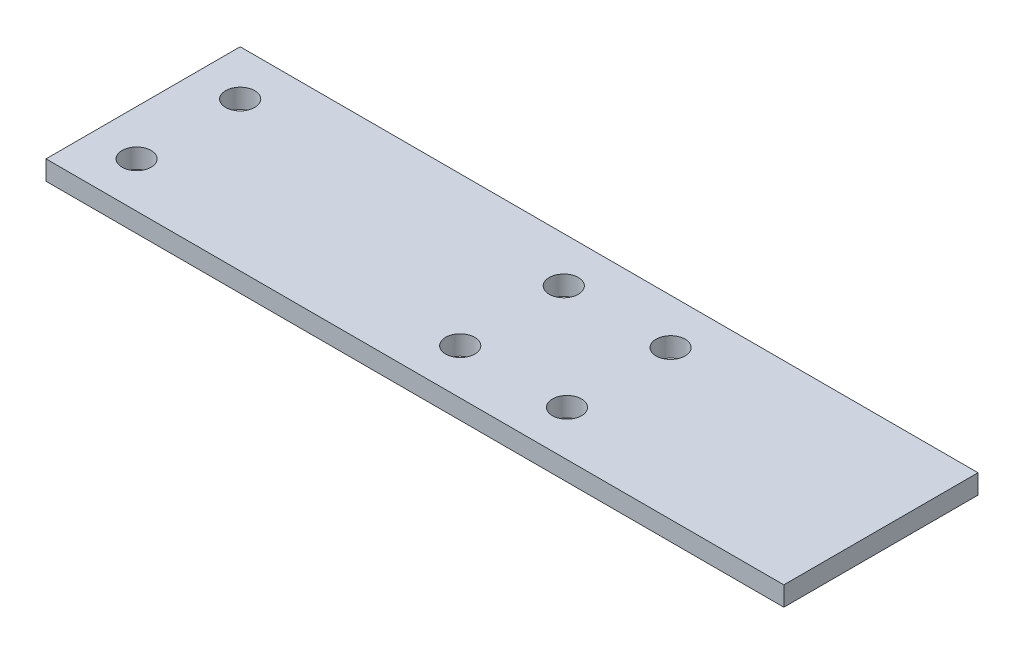
ISO-10303-21;
HEADER;
FILE_DESCRIPTION(('STEP AP214'),'2;1');
FILE_NAME('part.step','',(''),(''),'','','');
FILE_SCHEMA(('AUTOMOTIVE_DESIGN { 1 0 10303 214 1 1 1 1 }'));
ENDSEC;
DATA;
#1=APPLICATION_CONTEXT('core data for automotive mechanical design processes');
#2=APPLICATION_PROTOCOL_DEFINITION('international standard','automotive_design',2000,#1);
#3=PRODUCT_CONTEXT('',#1,'mechanical');
#4=PRODUCT('Part','Part','',(#3));
#5=PRODUCT_RELATED_PRODUCT_CATEGORY('part','',(#4));
#6=PRODUCT_DEFINITION_FORMATION('','',#4);
#7=PRODUCT_DEFINITION_CONTEXT('part definition',#1,'design');
#8=PRODUCT_DEFINITION('design','',#6,#7);
#9=PRODUCT_DEFINITION_SHAPE('','',#8);
#10=(LENGTH_UNIT() NAMED_UNIT(*) SI_UNIT(.MILLI.,.METRE.));
#11=(NAMED_UNIT(*) PLANE_ANGLE_UNIT() SI_UNIT($,.RADIAN.));
#12=(NAMED_UNIT(*) SI_UNIT($,.STERADIAN.) SOLID_ANGLE_UNIT());
#13=UNCERTAINTY_MEASURE_WITH_UNIT(LENGTH_MEASURE(1.E-05),#10,'distance_accuracy_value','');
#14=(GEOMETRIC_REPRESENTATION_CONTEXT(3) GLOBAL_UNCERTAINTY_ASSIGNED_CONTEXT((#13)) GLOBAL_UNIT_ASSIGNED_CONTEXT((#10,
#11,#12)) REPRESENTATION_CONTEXT('',''));
#15=CARTESIAN_POINT('',(0.,0.,0.));
#16=DIRECTION('',(0.,0.,1.));
#17=DIRECTION('',(1.,0.,0.));
#18=AXIS2_PLACEMENT_3D('',#15,#16,#17);
#19=CARTESIAN_POINT('',(0.,3.,0.));
#20=DIRECTION('',(0.,-1.,0.));
#21=DIRECTION('',(0.,0.,-1.));
#22=AXIS2_PLACEMENT_3D('',#19,#20,#21);
#23=PLANE('',#22);
#24=DIRECTION('',(-1.,0.,0.));
#25=VECTOR('',#24,1.);
#26=CARTESIAN_POINT('',(-7.,3.,-23.));
#27=LINE('',#26,#25);
#28=CARTESIAN_POINT('',(107.,3.,-23.));
#29=VERTEX_POINT('',#28);
#30=CARTESIAN_POINT('',(-7.,3.,-23.));
#31=VERTEX_POINT('',#30);
#32=EDGE_CURVE('E50',#29,#31,#27,.T.);
#33=ORIENTED_EDGE('',*,*,#32,.T.);
#34=DIRECTION('',(0.,0.,1.));
#35=VECTOR('',#34,1.);
#36=CARTESIAN_POINT('',(-7.,3.,-23.));
#37=LINE('',#36,#35);
#38=CARTESIAN_POINT('',(-7.,3.,7.));
#39=VERTEX_POINT('',#38);
#40=EDGE_CURVE('E80',#31,#39,#37,.T.);
#41=ORIENTED_EDGE('',*,*,#40,.T.);
#42=DIRECTION('',(1.,0.,0.));
#43=VECTOR('',#42,1.);
#44=CARTESIAN_POINT('',(57.,3.,7.));
#45=LINE('',#44,#43);
#46=CARTESIAN_POINT('',(107.,3.,7.));
#47=VERTEX_POINT('',#46);
#48=EDGE_CURVE('E84',#39,#47,#45,.T.);
#49=ORIENTED_EDGE('',*,*,#48,.T.);
#50=DIRECTION('',(0.,0.,-1.));
#51=VECTOR('',#50,1.);
#52=CARTESIAN_POINT('',(107.,3.,-23.));
#53=LINE('',#52,#51);
#54=EDGE_CURVE('E92',#47,#29,#53,.T.);
#55=ORIENTED_EDGE('',*,*,#54,.T.);
#56=EDGE_LOOP('',(#33,#41,#49,#55));
#57=FACE_BOUND('',#56,.T.);
#58=CARTESIAN_POINT('',(0.,3.,0.));
#59=DIRECTION('',(0.,1.,0.));
#60=DIRECTION('',(0.,0.,1.));
#61=AXIS2_PLACEMENT_3D('',#58,#59,#60);
#62=CIRCLE('',#61,2.25);
#63=CARTESIAN_POINT('',(0.,3.,2.25));
#64=VERTEX_POINT('',#63);
#65=EDGE_CURVE('E99',#64,#64,#62,.T.);
#66=ORIENTED_EDGE('',*,*,#65,.F.);
#67=EDGE_LOOP('',(#66));
#68=FACE_BOUND('',#67,.T.);
#69=CARTESIAN_POINT('',(0.,3.,-16.));
#70=DIRECTION('',(0.,1.,0.));
#71=DIRECTION('',(0.,0.,1.));
#72=AXIS2_PLACEMENT_3D('',#69,#70,#71);
#73=CIRCLE('',#72,2.25);
#74=CARTESIAN_POINT('',(0.,3.,-13.75));
#75=VERTEX_POINT('',#74);
#76=EDGE_CURVE('E180',#75,#75,#73,.T.);
#77=ORIENTED_EDGE('',*,*,#76,.F.);
#78=EDGE_LOOP('',(#77));
#79=FACE_BOUND('',#78,.T.);
#80=CARTESIAN_POINT('',(50.,3.,0.));
#81=DIRECTION('',(0.,1.,0.));
#82=DIRECTION('',(0.,0.,1.));
#83=AXIS2_PLACEMENT_3D('',#80,#81,#82);
#84=CIRCLE('',#83,2.25);
#85=CARTESIAN_POINT('',(50.,3.,2.25));
#86=VERTEX_POINT('',#85);
#87=EDGE_CURVE('E174',#86,#86,#84,.T.);
#88=ORIENTED_EDGE('',*,*,#87,.F.);
#89=EDGE_LOOP('',(#88));
#90=FACE_BOUND('',#89,.T.);
#91=CARTESIAN_POINT('',(50.,3.,-16.));
#92=DIRECTION('',(0.,1.,0.));
#93=DIRECTION('',(0.,0.,1.));
#94=AXIS2_PLACEMENT_3D('',#91,#92,#93);
#95=CIRCLE('',#94,2.25);
#96=CARTESIAN_POINT('',(50.,3.,-13.75));
#97=VERTEX_POINT('',#96);
#98=EDGE_CURVE('E168',#97,#97,#95,.T.);
#99=ORIENTED_EDGE('',*,*,#98,.F.);
#100=EDGE_LOOP('',(#99));
#101=FACE_BOUND('',#100,.T.);
#102=CARTESIAN_POINT('',(66.5,3.,-16.));
#103=DIRECTION('',(0.,1.,0.));
#104=DIRECTION('',(0.,0.,1.));
#105=AXIS2_PLACEMENT_3D('',#102,#103,#104);
#106=CIRCLE('',#105,2.25);
#107=CARTESIAN_POINT('',(66.5,3.,-13.75));
#108=VERTEX_POINT('',#107);
#109=EDGE_CURVE('E162',#108,#108,#106,.T.);
#110=ORIENTED_EDGE('',*,*,#109,.F.);
#111=EDGE_LOOP('',(#110));
#112=FACE_BOUND('',#111,.T.);
#113=CARTESIAN_POINT('',(66.5,3.,0.));
#114=DIRECTION('',(0.,1.,0.));
#115=DIRECTION('',(0.,0.,1.));
#116=AXIS2_PLACEMENT_3D('',#113,#114,#115);
#117=CIRCLE('',#116,2.25);
#118=CARTESIAN_POINT('',(66.5,3.,2.25));
#119=VERTEX_POINT('',#118);
#120=EDGE_CURVE('E153',#119,#119,#117,.T.);
#121=ORIENTED_EDGE('',*,*,#120,.F.);
#122=EDGE_LOOP('',(#121));
#123=FACE_BOUND('',#122,.T.);
#124=ADVANCED_FACE('F33',(#57,#68,#79,#90,#101,#112,#123),#23,.F.);
#125=CARTESIAN_POINT('',(0.,0.,0.));
#126=DIRECTION('',(0.,-1.,0.));
#127=DIRECTION('',(0.,0.,-1.));
#128=AXIS2_PLACEMENT_3D('',#125,#126,#127);
#129=PLANE('',#128);
#130=CARTESIAN_POINT('',(66.5,0.,-16.));
#131=DIRECTION('',(0.,1.,0.));
#132=DIRECTION('',(0.,0.,1.));
#133=AXIS2_PLACEMENT_3D('',#130,#131,#132);
#134=CIRCLE('',#133,2.25);
#135=CARTESIAN_POINT('',(66.5,0.,-13.75));
#136=VERTEX_POINT('',#135);
#137=EDGE_CURVE('E159',#136,#136,#134,.T.);
#138=ORIENTED_EDGE('',*,*,#137,.T.);
#139=EDGE_LOOP('',(#138));
#140=FACE_BOUND('',#139,.T.);
#141=CARTESIAN_POINT('',(50.,0.,0.));
#142=DIRECTION('',(0.,1.,0.));
#143=DIRECTION('',(0.,0.,1.));
#144=AXIS2_PLACEMENT_3D('',#141,#142,#143);
#145=CIRCLE('',#144,2.25);
#146=CARTESIAN_POINT('',(50.,0.,2.25));
#147=VERTEX_POINT('',#146);
#148=EDGE_CURVE('E171',#147,#147,#145,.T.);
#149=ORIENTED_EDGE('',*,*,#148,.T.);
#150=EDGE_LOOP('',(#149));
#151=FACE_BOUND('',#150,.T.);
#152=CARTESIAN_POINT('',(0.,0.,0.));
#153=DIRECTION('',(0.,1.,0.));
#154=DIRECTION('',(0.,0.,1.));
#155=AXIS2_PLACEMENT_3D('',#152,#153,#154);
#156=CIRCLE('',#155,2.25);
#157=CARTESIAN_POINT('',(0.,0.,2.25));
#158=VERTEX_POINT('',#157);
#159=EDGE_CURVE('E183',#158,#158,#156,.T.);
#160=ORIENTED_EDGE('',*,*,#159,.T.);
#161=EDGE_LOOP('',(#160));
#162=FACE_BOUND('',#161,.T.);
#163=DIRECTION('',(0.,0.,1.));
#164=VECTOR('',#163,1.);
#165=CARTESIAN_POINT('',(-7.,0.,-23.));
#166=LINE('',#165,#164);
#167=CARTESIAN_POINT('',(-7.,0.,-23.));
#168=VERTEX_POINT('',#167);
#169=CARTESIAN_POINT('',(-7.,0.,7.));
#170=VERTEX_POINT('',#169);
#171=EDGE_CURVE('E88',#168,#170,#166,.T.);
#172=ORIENTED_EDGE('',*,*,#171,.F.);
#173=DIRECTION('',(-1.,0.,0.));
#174=VECTOR('',#173,1.);
#175=CARTESIAN_POINT('',(57.,0.,-23.));
#176=LINE('',#175,#174);
#177=CARTESIAN_POINT('',(107.,0.,-23.));
#178=VERTEX_POINT('',#177);
#179=EDGE_CURVE('E102',#178,#168,#176,.T.);
#180=ORIENTED_EDGE('',*,*,#179,.F.);
#181=DIRECTION('',(0.,0.,-1.));
#182=VECTOR('',#181,1.);
#183=CARTESIAN_POINT('',(107.,0.,-23.));
#184=LINE('',#183,#182);
#185=CARTESIAN_POINT('',(107.,0.,7.));
#186=VERTEX_POINT('',#185);
#187=EDGE_CURVE('E74',#186,#178,#184,.T.);
#188=ORIENTED_EDGE('',*,*,#187,.F.);
#189=DIRECTION('',(1.,0.,0.));
#190=VECTOR('',#189,1.);
#191=CARTESIAN_POINT('',(107.,0.,7.));
#192=LINE('',#191,#190);
#193=EDGE_CURVE('E67',#170,#186,#192,.T.);
#194=ORIENTED_EDGE('',*,*,#193,.F.);
#195=EDGE_LOOP('',(#172,#180,#188,#194));
#196=FACE_BOUND('',#195,.T.);
#197=CARTESIAN_POINT('',(0.,0.,-16.));
#198=DIRECTION('',(0.,1.,0.));
#199=DIRECTION('',(0.,0.,1.));
#200=AXIS2_PLACEMENT_3D('',#197,#198,#199);
#201=CIRCLE('',#200,2.25);
#202=CARTESIAN_POINT('',(0.,0.,-13.75));
#203=VERTEX_POINT('',#202);
#204=EDGE_CURVE('E177',#203,#203,#201,.T.);
#205=ORIENTED_EDGE('',*,*,#204,.T.);
#206=EDGE_LOOP('',(#205));
#207=FACE_BOUND('',#206,.T.);
#208=CARTESIAN_POINT('',(50.,0.,-16.));
#209=DIRECTION('',(0.,1.,0.));
#210=DIRECTION('',(0.,0.,1.));
#211=AXIS2_PLACEMENT_3D('',#208,#209,#210);
#212=CIRCLE('',#211,2.25);
#213=CARTESIAN_POINT('',(50.,0.,-13.75));
#214=VERTEX_POINT('',#213);
#215=EDGE_CURVE('E165',#214,#214,#212,.T.);
#216=ORIENTED_EDGE('',*,*,#215,.T.);
#217=EDGE_LOOP('',(#216));
#218=FACE_BOUND('',#217,.T.);
#219=CARTESIAN_POINT('',(66.5,0.,0.));
#220=DIRECTION('',(0.,1.,0.));
#221=DIRECTION('',(0.,0.,1.));
#222=AXIS2_PLACEMENT_3D('',#219,#220,#221);
#223=CIRCLE('',#222,2.25);
#224=CARTESIAN_POINT('',(66.5,0.,2.25));
#225=VERTEX_POINT('',#224);
#226=EDGE_CURVE('E156',#225,#225,#223,.T.);
#227=ORIENTED_EDGE('',*,*,#226,.T.);
#228=EDGE_LOOP('',(#227));
#229=FACE_BOUND('',#228,.T.);
#230=ADVANCED_FACE('F108',(#140,#151,#162,#196,#207,#218,#229),#129,.T.);
#231=CARTESIAN_POINT('',(-7.,3.,-23.));
#232=DIRECTION('',(1.,0.,0.));
#233=DIRECTION('',(0.,0.,-1.));
#234=AXIS2_PLACEMENT_3D('',#231,#232,#233);
#235=PLANE('',#234);
#236=ORIENTED_EDGE('',*,*,#171,.T.);
#237=DIRECTION('',(0.,-1.,0.));
#238=VECTOR('',#237,1.);
#239=CARTESIAN_POINT('',(-7.,3.,7.));
#240=LINE('',#239,#238);
#241=EDGE_CURVE('E42',#39,#170,#240,.T.);
#242=ORIENTED_EDGE('',*,*,#241,.F.);
#243=ORIENTED_EDGE('',*,*,#40,.F.);
#244=DIRECTION('',(0.,-1.,0.));
#245=VECTOR('',#244,1.);
#246=CARTESIAN_POINT('',(-7.,3.,-23.));
#247=LINE('',#246,#245);
#248=EDGE_CURVE('E11',#31,#168,#247,.T.);
#249=ORIENTED_EDGE('',*,*,#248,.T.);
#250=EDGE_LOOP('',(#236,#242,#243,#249));
#251=FACE_BOUND('',#250,.T.);
#252=ADVANCED_FACE('F35',(#251),#235,.F.);
#253=CARTESIAN_POINT('',(107.,3.,7.));
#254=DIRECTION('',(0.,0.,-1.));
#255=DIRECTION('',(-1.,0.,0.));
#256=AXIS2_PLACEMENT_3D('',#253,#254,#255);
#257=PLANE('',#256);
#258=ORIENTED_EDGE('',*,*,#193,.T.);
#259=DIRECTION('',(0.,-1.,0.));
#260=VECTOR('',#259,1.);
#261=CARTESIAN_POINT('',(107.,3.,7.));
#262=LINE('',#261,#260);
#263=EDGE_CURVE('E89',#47,#186,#262,.T.);
#264=ORIENTED_EDGE('',*,*,#263,.F.);
#265=ORIENTED_EDGE('',*,*,#48,.F.);
#266=ORIENTED_EDGE('',*,*,#241,.T.);
#267=EDGE_LOOP('',(#258,#264,#265,#266));
#268=FACE_BOUND('',#267,.T.);
#269=ADVANCED_FACE('F90',(#268),#257,.F.);
#270=CARTESIAN_POINT('',(107.,3.,-23.));
#271=DIRECTION('',(-1.,0.,0.));
#272=DIRECTION('',(0.,0.,1.));
#273=AXIS2_PLACEMENT_3D('',#270,#271,#272);
#274=PLANE('',#273);
#275=ORIENTED_EDGE('',*,*,#187,.T.);
#276=DIRECTION('',(0.,-1.,0.));
#277=VECTOR('',#276,1.);
#278=CARTESIAN_POINT('',(107.,3.,-23.));
#279=LINE('',#278,#277);
#280=EDGE_CURVE('E94',#29,#178,#279,.T.);
#281=ORIENTED_EDGE('',*,*,#280,.F.);
#282=ORIENTED_EDGE('',*,*,#54,.F.);
#283=ORIENTED_EDGE('',*,*,#263,.T.);
#284=EDGE_LOOP('',(#275,#281,#282,#283));
#285=FACE_BOUND('',#284,.T.);
#286=ADVANCED_FACE('F105',(#285),#274,.F.);
#287=CARTESIAN_POINT('',(57.,3.,-23.));
#288=DIRECTION('',(0.,0.,1.));
#289=DIRECTION('',(1.,0.,0.));
#290=AXIS2_PLACEMENT_3D('',#287,#288,#289);
#291=PLANE('',#290);
#292=ORIENTED_EDGE('',*,*,#179,.T.);
#293=ORIENTED_EDGE('',*,*,#248,.F.);
#294=ORIENTED_EDGE('',*,*,#32,.F.);
#295=ORIENTED_EDGE('',*,*,#280,.T.);
#296=EDGE_LOOP('',(#292,#293,#294,#295));
#297=FACE_BOUND('',#296,.T.);
#298=ADVANCED_FACE('F110',(#297),#291,.F.);
#299=CARTESIAN_POINT('',(0.,3.,0.));
#300=DIRECTION('',(0.,-1.,0.));
#301=DIRECTION('',(0.,0.,-1.));
#302=AXIS2_PLACEMENT_3D('',#299,#300,#301);
#303=CYLINDRICAL_SURFACE('',#302,2.25);
#304=ORIENTED_EDGE('',*,*,#65,.T.);
#305=EDGE_LOOP('',(#304));
#306=FACE_BOUND('',#305,.T.);
#307=ORIENTED_EDGE('',*,*,#159,.F.);
#308=EDGE_LOOP('',(#307));
#309=FACE_BOUND('',#308,.T.);
#310=ADVANCED_FACE('F112',(#306,#309),#303,.F.);
#311=CARTESIAN_POINT('',(0.,3.,-16.));
#312=DIRECTION('',(0.,-1.,0.));
#313=DIRECTION('',(0.,0.,-1.));
#314=AXIS2_PLACEMENT_3D('',#311,#312,#313);
#315=CYLINDRICAL_SURFACE('',#314,2.25);
#316=ORIENTED_EDGE('',*,*,#76,.T.);
#317=EDGE_LOOP('',(#316));
#318=FACE_BOUND('',#317,.T.);
#319=ORIENTED_EDGE('',*,*,#204,.F.);
#320=EDGE_LOOP('',(#319));
#321=FACE_BOUND('',#320,.T.);
#322=ADVANCED_FACE('F118',(#318,#321),#315,.F.);
#323=CARTESIAN_POINT('',(50.,3.,0.));
#324=DIRECTION('',(0.,-1.,0.));
#325=DIRECTION('',(0.,0.,-1.));
#326=AXIS2_PLACEMENT_3D('',#323,#324,#325);
#327=CYLINDRICAL_SURFACE('',#326,2.25);
#328=ORIENTED_EDGE('',*,*,#87,.T.);
#329=EDGE_LOOP('',(#328));
#330=FACE_BOUND('',#329,.T.);
#331=ORIENTED_EDGE('',*,*,#148,.F.);
#332=EDGE_LOOP('',(#331));
#333=FACE_BOUND('',#332,.T.);
#334=ADVANCED_FACE('F132',(#330,#333),#327,.F.);
#335=CARTESIAN_POINT('',(50.,3.,-16.));
#336=DIRECTION('',(0.,-1.,0.));
#337=DIRECTION('',(0.,0.,-1.));
#338=AXIS2_PLACEMENT_3D('',#335,#336,#337);
#339=CYLINDRICAL_SURFACE('',#338,2.25);
#340=ORIENTED_EDGE('',*,*,#98,.T.);
#341=EDGE_LOOP('',(#340));
#342=FACE_BOUND('',#341,.T.);
#343=ORIENTED_EDGE('',*,*,#215,.F.);
#344=EDGE_LOOP('',(#343));
#345=FACE_BOUND('',#344,.T.);
#346=ADVANCED_FACE('F136',(#342,#345),#339,.F.);
#347=CARTESIAN_POINT('',(66.5,3.,-16.));
#348=DIRECTION('',(0.,-1.,0.));
#349=DIRECTION('',(0.,0.,-1.));
#350=AXIS2_PLACEMENT_3D('',#347,#348,#349);
#351=CYLINDRICAL_SURFACE('',#350,2.25);
#352=ORIENTED_EDGE('',*,*,#109,.T.);
#353=EDGE_LOOP('',(#352));
#354=FACE_BOUND('',#353,.T.);
#355=ORIENTED_EDGE('',*,*,#137,.F.);
#356=EDGE_LOOP('',(#355));
#357=FACE_BOUND('',#356,.T.);
#358=ADVANCED_FACE('F140',(#354,#357),#351,.F.);
#359=CARTESIAN_POINT('',(66.5,3.,0.));
#360=DIRECTION('',(0.,-1.,0.));
#361=DIRECTION('',(0.,0.,-1.));
#362=AXIS2_PLACEMENT_3D('',#359,#360,#361);
#363=CYLINDRICAL_SURFACE('',#362,2.25);
#364=ORIENTED_EDGE('',*,*,#120,.T.);
#365=EDGE_LOOP('',(#364));
#366=FACE_BOUND('',#365,.T.);
#367=ORIENTED_EDGE('',*,*,#226,.F.);
#368=EDGE_LOOP('',(#367));
#369=FACE_BOUND('',#368,.T.);
#370=ADVANCED_FACE('F144',(#366,#369),#363,.F.);
#371=CLOSED_SHELL('',(#124,#230,#252,#269,#286,#298,#310,#322,#334,#346,#358,#370));
#372=MANIFOLD_SOLID_BREP('B2',#371);
#373=ADVANCED_BREP_SHAPE_REPRESENTATION('',(#18,#372),#14);
#374=SHAPE_DEFINITION_REPRESENTATION(#9,#373);
ENDSEC;
END-ISO-10303-21;
